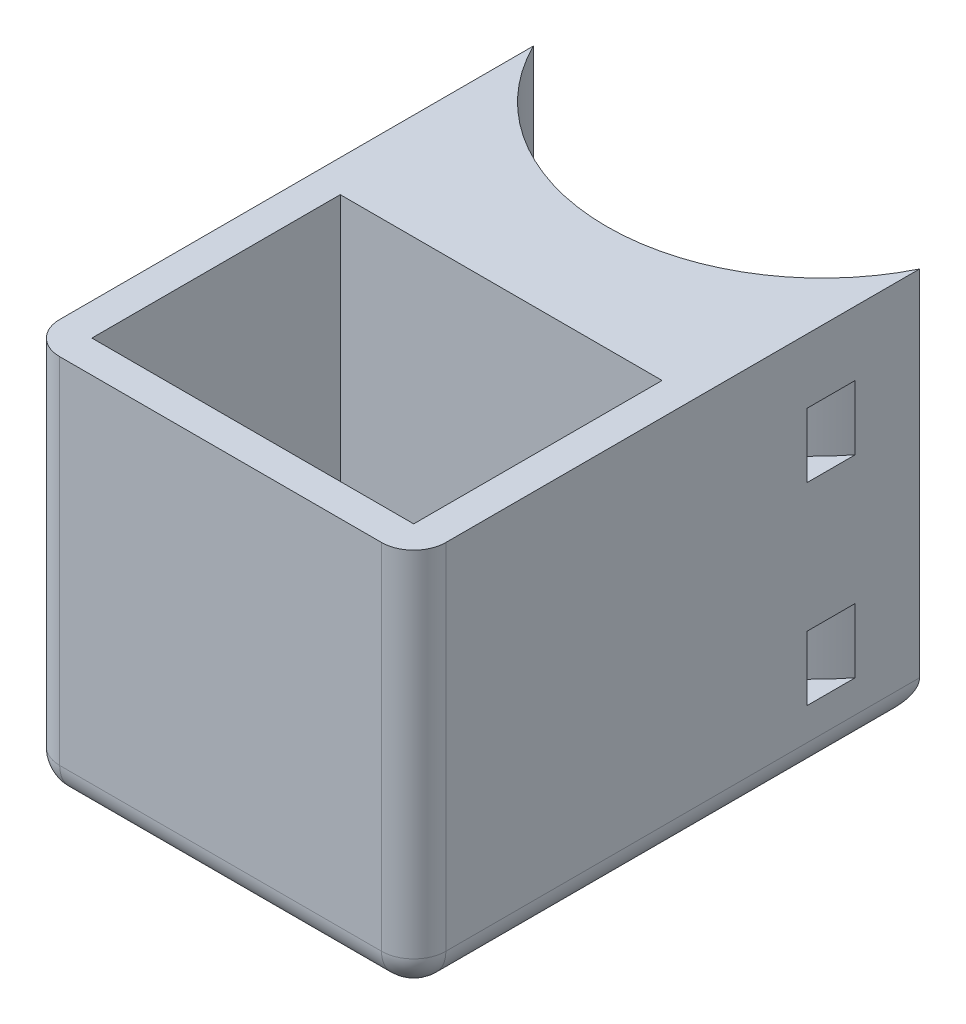
ISO-10303-21;
HEADER;
FILE_DESCRIPTION(('STEP AP214'),'2;1');
FILE_NAME('part.step','',(''),(''),'','','');
FILE_SCHEMA(('AUTOMOTIVE_DESIGN { 1 0 10303 214 1 1 1 1 }'));
ENDSEC;
DATA;
#1=APPLICATION_CONTEXT('core data for automotive mechanical design processes');
#2=APPLICATION_PROTOCOL_DEFINITION('international standard','automotive_design',2000,#1);
#3=PRODUCT_CONTEXT('',#1,'mechanical');
#4=PRODUCT('Part','Part','',(#3));
#5=PRODUCT_RELATED_PRODUCT_CATEGORY('part','',(#4));
#6=PRODUCT_DEFINITION_FORMATION('','',#4);
#7=PRODUCT_DEFINITION_CONTEXT('part definition',#1,'design');
#8=PRODUCT_DEFINITION('design','',#6,#7);
#9=PRODUCT_DEFINITION_SHAPE('','',#8);
#10=(LENGTH_UNIT() NAMED_UNIT(*) SI_UNIT(.MILLI.,.METRE.));
#11=(NAMED_UNIT(*) PLANE_ANGLE_UNIT() SI_UNIT($,.RADIAN.));
#12=(NAMED_UNIT(*) SI_UNIT($,.STERADIAN.) SOLID_ANGLE_UNIT());
#13=UNCERTAINTY_MEASURE_WITH_UNIT(LENGTH_MEASURE(1.E-05),#10,'distance_accuracy_value','');
#14=(GEOMETRIC_REPRESENTATION_CONTEXT(3) GLOBAL_UNCERTAINTY_ASSIGNED_CONTEXT((#13)) GLOBAL_UNIT_ASSIGNED_CONTEXT((#10,
#11,#12)) REPRESENTATION_CONTEXT('',''));
#15=CARTESIAN_POINT('',(0.,0.,0.));
#16=DIRECTION('',(0.,0.,1.));
#17=DIRECTION('',(1.,0.,0.));
#18=AXIS2_PLACEMENT_3D('',#15,#16,#17);
#19=CARTESIAN_POINT('',(0.,127.,-157.374146758345));
#20=DIRECTION('',(0.,-1.,0.));
#21=DIRECTION('',(0.,0.,-1.));
#22=AXIS2_PLACEMENT_3D('',#19,#20,#21);
#23=CYLINDRICAL_SURFACE('',#22,96.5864039940724);
#24=CARTESIAN_POINT('',(0.,50.8,-157.374146758345));
#25=DIRECTION('',(0.,1.,0.));
#26=DIRECTION('',(0.,0.,1.));
#27=AXIS2_PLACEMENT_3D('',#24,#25,#26);
#28=CIRCLE('',#27,96.5864039940724);
#29=CARTESIAN_POINT('',(-76.2,50.8,-98.023549149676));
#30=VERTEX_POINT('',#29);
#31=CARTESIAN_POINT('',(76.2,50.8,-98.023549149676));
#32=VERTEX_POINT('',#31);
#33=EDGE_CURVE('E295',#30,#32,#28,.T.);
#34=ORIENTED_EDGE('',*,*,#33,.F.);
#35=DIRECTION('',(0.,-1.,0.));
#36=VECTOR('',#35,1.);
#37=CARTESIAN_POINT('',(-76.2,127.,-98.023549149676));
#38=LINE('',#37,#36);
#39=CARTESIAN_POINT('',(-76.2,25.4,-98.023549149676));
#40=VERTEX_POINT('',#39);
#41=EDGE_CURVE('E338',#30,#40,#38,.T.);
#42=ORIENTED_EDGE('',*,*,#41,.T.);
#43=CARTESIAN_POINT('',(0.,25.4,-157.374146758345));
#44=DIRECTION('',(0.,1.,0.));
#45=DIRECTION('',(0.,0.,1.));
#46=AXIS2_PLACEMENT_3D('',#43,#44,#45);
#47=CIRCLE('',#46,96.5864039940724);
#48=CARTESIAN_POINT('',(76.2,25.4,-98.023549149676));
#49=VERTEX_POINT('',#48);
#50=EDGE_CURVE('E325',#40,#49,#47,.T.);
#51=ORIENTED_EDGE('',*,*,#50,.T.);
#52=DIRECTION('',(0.,-1.,0.));
#53=VECTOR('',#52,1.);
#54=CARTESIAN_POINT('',(76.2,127.,-98.023549149676));
#55=LINE('',#54,#53);
#56=EDGE_CURVE('E330',#32,#49,#55,.T.);
#57=ORIENTED_EDGE('',*,*,#56,.F.);
#58=EDGE_LOOP('',(#34,#42,#51,#57));
#59=FACE_BOUND('',#58,.T.);
#60=ADVANCED_FACE('F67',(#59),#23,.T.);
#61=CARTESIAN_POINT('',(0.,127.,-153.633996509707));
#62=DIRECTION('',(0.,-1.,0.));
#63=DIRECTION('',(0.,0.,-1.));
#64=AXIS2_PLACEMENT_3D('',#61,#62,#63);
#65=CYLINDRICAL_SURFACE('',#64,106.68);
#66=DIRECTION('',(0.,-1.,0.));
#67=VECTOR('',#66,1.);
#68=CARTESIAN_POINT('',(-76.2,127.,-78.973549149676));
#69=LINE('',#68,#67);
#70=CARTESIAN_POINT('',(-76.2,50.8,-78.973549149676));
#71=VERTEX_POINT('',#70);
#72=CARTESIAN_POINT('',(-76.2,25.4,-78.973549149676));
#73=VERTEX_POINT('',#72);
#74=EDGE_CURVE('E320',#71,#73,#69,.T.);
#75=ORIENTED_EDGE('',*,*,#74,.F.);
#76=CARTESIAN_POINT('',(0.,50.8,-153.633996509707));
#77=DIRECTION('',(0.,1.,0.));
#78=DIRECTION('',(0.,0.,1.));
#79=AXIS2_PLACEMENT_3D('',#76,#77,#78);
#80=CIRCLE('',#79,106.68);
#81=CARTESIAN_POINT('',(76.2,50.8,-78.973549149676));
#82=VERTEX_POINT('',#81);
#83=EDGE_CURVE('E362',#71,#82,#80,.T.);
#84=ORIENTED_EDGE('',*,*,#83,.T.);
#85=DIRECTION('',(0.,-1.,0.));
#86=VECTOR('',#85,1.);
#87=CARTESIAN_POINT('',(76.2,127.,-78.973549149676));
#88=LINE('',#87,#86);
#89=CARTESIAN_POINT('',(76.2,25.4,-78.973549149676));
#90=VERTEX_POINT('',#89);
#91=EDGE_CURVE('E312',#82,#90,#88,.T.);
#92=ORIENTED_EDGE('',*,*,#91,.T.);
#93=CARTESIAN_POINT('',(0.,25.4,-153.633996509707));
#94=DIRECTION('',(0.,1.,0.));
#95=DIRECTION('',(0.,0.,1.));
#96=AXIS2_PLACEMENT_3D('',#93,#94,#95);
#97=CIRCLE('',#96,106.68);
#98=EDGE_CURVE('E308',#73,#90,#97,.T.);
#99=ORIENTED_EDGE('',*,*,#98,.F.);
#100=EDGE_LOOP('',(#75,#84,#92,#99));
#101=FACE_BOUND('',#100,.T.);
#102=ADVANCED_FACE('F461',(#101),#65,.F.);
#103=CARTESIAN_POINT('',(0.,25.4,-161.29));
#104=DIRECTION('',(0.,-1.,0.));
#105=DIRECTION('',(0.,0.,-1.));
#106=AXIS2_PLACEMENT_3D('',#103,#104,#105);
#107=CYLINDRICAL_SURFACE('',#106,85.09);
#108=CARTESIAN_POINT('',(0.,0.,-161.29));
#109=DIRECTION('',(0.,1.,0.));
#110=DIRECTION('',(0.,0.,1.));
#111=AXIS2_PLACEMENT_3D('',#108,#109,#110);
#112=CIRCLE('',#111,85.09);
#113=CARTESIAN_POINT('',(-63.5,0.,-104.650278072716));
#114=VERTEX_POINT('',#113);
#115=CARTESIAN_POINT('',(63.5,0.,-104.650278072716));
#116=VERTEX_POINT('',#115);
#117=EDGE_CURVE('E342',#114,#116,#112,.T.);
#118=ORIENTED_EDGE('',*,*,#117,.F.);
#119=CARTESIAN_POINT('',(-63.5,0.,-104.650278072716));
#120=CARTESIAN_POINT('',(-63.775555582153,1.74329036094173E-05,-104.959199184089));
#121=CARTESIAN_POINT('',(-64.0488209399557,0.00896784177205182,-105.270110950656));
#122=CARTESIAN_POINT('',(-64.5902797715244,0.0439741666666042,-105.895284224631));
#123=CARTESIAN_POINT('',(-64.8584740882358,0.0700272135884523,-106.20954516149));
#124=CARTESIAN_POINT('',(-65.3892789981902,0.138464297963817,-106.840754684055));
#125=CARTESIAN_POINT('',(-65.6518919223825,0.180841370774738,-107.157702067264));
#126=CARTESIAN_POINT('',(-66.1712873683295,0.28129702221995,-107.793854658195));
#127=CARTESIAN_POINT('',(-66.4280695883808,0.339376411355726,-108.113059981637));
#128=CARTESIAN_POINT('',(-67.2001835677938,0.539180619476351,-109.087136619463));
#129=CARTESIAN_POINT('',(-67.7059041821652,0.704974403099761,-109.74493421086));
#130=CARTESIAN_POINT('',(-68.4435332361487,0.998655645986949,-110.73349310702));
#131=CARTESIAN_POINT('',(-68.6859501140861,1.10406574859274,-111.063369518362));
#132=CARTESIAN_POINT('',(-69.163630378677,1.32972857590381,-111.723216079681));
#133=CARTESIAN_POINT('',(-69.3988945102081,1.44997974843511,-112.053186216261));
#134=CARTESIAN_POINT('',(-69.8683009246733,1.70870806981273,-112.721492884302));
#135=CARTESIAN_POINT('',(-70.102241049244,1.8475899629451,-113.059814513359));
#136=CARTESIAN_POINT('',(-70.56209004219,2.14105660425114,-113.735122148983));
#137=CARTESIAN_POINT('',(-70.7879987637361,2.29564163930878,-114.072108131032));
#138=CARTESIAN_POINT('',(-71.2316826726435,2.62097071012814,-114.744132959535));
#139=CARTESIAN_POINT('',(-71.449450509961,2.79172887885392,-115.079169826308));
#140=CARTESIAN_POINT('',(-71.8762805594316,3.14984094161772,-115.745899987749));
#141=CARTESIAN_POINT('',(-72.0853431239304,3.33719416300954,-116.077593417328));
#142=CARTESIAN_POINT('',(-72.4923485521392,3.72746393816045,-116.73312740641));
#143=CARTESIAN_POINT('',(-72.6903791006649,3.93021326973872,-117.057012826747));
#144=CARTESIAN_POINT('',(-73.0769126119393,4.35404071126196,-117.698565360375));
#145=CARTESIAN_POINT('',(-73.2654139336934,4.57512196089213,-118.016231396915));
#146=CARTESIAN_POINT('',(-73.6316780156799,5.03672639947328,-118.642427963342));
#147=CARTESIAN_POINT('',(-73.8094607579908,5.27721132548423,-118.950974908933));
#148=CARTESIAN_POINT('',(-74.1534599769584,5.7799871946011,-119.556398821547));
#149=CARTESIAN_POINT('',(-74.3196825701651,6.04226644244379,-119.853281923244));
#150=CARTESIAN_POINT('',(-74.5722782122996,6.47675118037862,-120.310486569207));
#151=CARTESIAN_POINT('',(-74.6630267166692,6.6408716010198,-120.476096474914));
#152=CARTESIAN_POINT('',(-74.8395678018916,6.97807411838782,-120.800726266946));
#153=CARTESIAN_POINT('',(-74.9253606928205,7.15115565312365,-120.959746565411));
#154=CARTESIAN_POINT('',(-75.0915831168897,7.50732220605154,-121.270088716859));
#155=CARTESIAN_POINT('',(-75.1720007956663,7.69042781299719,-121.421393390487));
#156=CARTESIAN_POINT('',(-75.3265200286137,8.06698337082451,-121.71411259188));
#157=CARTESIAN_POINT('',(-75.4006214326023,8.26043356749192,-121.855526884467));
#158=CARTESIAN_POINT('',(-75.5427070062571,8.6615339346853,-122.128391750724));
#159=CARTESIAN_POINT('',(-75.6105710907129,8.86936480016972,-122.259641171171));
#160=CARTESIAN_POINT('',(-75.7375496067297,9.29675529289151,-122.506614789715));
#161=CARTESIAN_POINT('',(-75.7966623548846,9.51631716567863,-122.622336000408));
#162=CARTESIAN_POINT('',(-75.9042925155677,9.96567379906672,-122.834044455191));
#163=CARTESIAN_POINT('',(-75.9528713952669,10.1953992278935,-122.930145980199));
#164=CARTESIAN_POINT('',(-76.0381808802664,10.6650736779157,-123.099527905418));
#165=CARTESIAN_POINT('',(-76.074922829761,10.9050126594823,-123.172830153499));
#166=CARTESIAN_POINT('',(-76.1358731627378,11.4005069405729,-123.294713622466));
#167=CARTESIAN_POINT('',(-76.159678903631,11.6563142057347,-123.342499948862));
#168=CARTESIAN_POINT('',(-76.1837444242691,12.0445026775911,-123.390851168122));
#169=CARTESIAN_POINT('',(-76.1898264049778,12.1751656766474,-123.40308168428));
#170=CARTESIAN_POINT('',(-76.1979588168233,12.4372039708797,-123.419441356604));
#171=CARTESIAN_POINT('',(-76.2000067035641,12.5685796632276,-123.423565399829));
#172=CARTESIAN_POINT('',(-76.2,12.7,-123.423549149676));
#173=B_SPLINE_CURVE_WITH_KNOTS('',3,(#119,#120,#121,#122,#123,#124,#125,#126,#127,#128,#129,
#130,#131,#132,#133,#134,#135,#136,#137,#138,#139,#140,#141,#142,#143,#144,#145,#146,#147,#148,
#149,#150,#151,#152,#153,#154,#155,#156,#157,#158,#159,#160,#161,#162,#163,#164,#165,#166,#167,
#168,#169,#170,#171,#172),.UNSPECIFIED.,.F.,.F.,(4,2,2,2,2,2,2,2,2,2,2,2,2,2,2,2,2,2,2,2,2,2,2,
2,2,2,4),(0.,1.24171487557004,2.4832214967578,3.72419901500327,4.96524060062538,7.5004109713181,
8.76835159756702,10.0361597266748,11.3382317538429,12.6403275731145,13.9435719212915,
15.2467634693014,16.5374071361811,17.8282723084104,19.1166514225717,20.4043435773973,
21.1546845292604,21.9049784807979,22.6568759508569,23.4087912938205,24.1730232898877,
24.9374021030615,25.6971928482703,26.456253249322,27.2377538242411,27.6316010200848,
28.0256965449931),.UNSPECIFIED.);
#174=CARTESIAN_POINT('',(-76.2,12.7,-123.423549149676));
#175=VERTEX_POINT('',#174);
#176=EDGE_CURVE('E403',#114,#175,#173,.T.);
#177=ORIENTED_EDGE('',*,*,#176,.T.);
#178=DIRECTION('',(0.,-1.,0.));
#179=VECTOR('',#178,1.);
#180=CARTESIAN_POINT('',(-76.2,25.4,-123.423549149676));
#181=LINE('',#180,#179);
#182=CARTESIAN_POINT('',(-76.2,152.4,-123.423549149676));
#183=VERTEX_POINT('',#182);
#184=EDGE_CURVE('E358',#183,#175,#181,.T.);
#185=ORIENTED_EDGE('',*,*,#184,.F.);
#186=CARTESIAN_POINT('',(0.,152.4,-161.29));
#187=DIRECTION('',(0.,1.,0.));
#188=DIRECTION('',(0.,0.,1.));
#189=AXIS2_PLACEMENT_3D('',#186,#187,#188);
#190=CIRCLE('',#189,85.09);
#191=CARTESIAN_POINT('',(76.2,152.4,-123.423549149676));
#192=VERTEX_POINT('',#191);
#193=EDGE_CURVE('E264',#183,#192,#190,.T.);
#194=ORIENTED_EDGE('',*,*,#193,.T.);
#195=DIRECTION('',(0.,-1.,0.));
#196=VECTOR('',#195,1.);
#197=CARTESIAN_POINT('',(76.2,25.4,-123.423549149676));
#198=LINE('',#197,#196);
#199=CARTESIAN_POINT('',(76.2,12.7,-123.423549149676));
#200=VERTEX_POINT('',#199);
#201=EDGE_CURVE('E351',#192,#200,#198,.T.);
#202=ORIENTED_EDGE('',*,*,#201,.T.);
#203=CARTESIAN_POINT('',(76.2,12.7,-123.423549149676));
#204=CARTESIAN_POINT('',(76.2000364031072,12.5227850028577,-123.423633286604));
#205=CARTESIAN_POINT('',(76.1962922413517,12.3456203522404,-123.416088044988));
#206=CARTESIAN_POINT('',(76.181524824488,11.9930589113384,-123.386387149417));
#207=CARTESIAN_POINT('',(76.1705114119517,11.8176600557377,-123.364251251279));
#208=CARTESIAN_POINT('',(76.1416723033843,11.472041720587,-123.306387706787));
#209=CARTESIAN_POINT('',(76.1239358024327,11.3017846637142,-123.270838047564));
#210=CARTESIAN_POINT('',(76.0820933318297,10.9651504964653,-123.187173701231));
#211=CARTESIAN_POINT('',(76.0579849046539,10.798774910096,-123.139054166255));
#212=CARTESIAN_POINT('',(75.9962772417849,10.4243659776945,-123.016250566514));
#213=CARTESIAN_POINT('',(75.9567908599935,10.2178437785034,-122.937902281436));
#214=CARTESIAN_POINT('',(75.8693306219624,9.81338613411481,-122.765175071078));
#215=CARTESIAN_POINT('',(75.8213500255618,9.61545766451327,-122.670783417775));
#216=CARTESIAN_POINT('',(75.7177465527705,9.22765738564796,-122.46804789016));
#217=CARTESIAN_POINT('',(75.6620857149879,9.03783214299981,-122.359634890192));
#218=CARTESIAN_POINT('',(75.5442977916486,8.66729959718517,-122.131556776976));
#219=CARTESIAN_POINT('',(75.4821721280181,8.48659030191176,-122.011894138623));
#220=CARTESIAN_POINT('',(75.3067598792863,8.01037037535388,-121.676155370391));
#221=CARTESIAN_POINT('',(75.18810504352,7.72305724096569,-121.451230086982));
#222=CARTESIAN_POINT('',(74.9374306641949,7.17124914604363,-120.981680578911));
#223=CARTESIAN_POINT('',(74.8054013033035,6.90677121494042,-120.737041911325));
#224=CARTESIAN_POINT('',(74.5299059512961,6.39802106017877,-120.232919445178));
#225=CARTESIAN_POINT('',(74.3864238476469,6.15377832485289,-119.973414882348));
#226=CARTESIAN_POINT('',(74.0895942021372,5.68374960079327,-119.443465502211));
#227=CARTESIAN_POINT('',(73.9362430515393,5.45797043280207,-119.17301669658));
#228=CARTESIAN_POINT('',(73.6285023518672,5.03393029888837,-118.637421830367));
#229=CARTESIAN_POINT('',(73.4745347861818,4.83486207074601,-118.372669119413));
#230=CARTESIAN_POINT('',(73.1592999983338,4.45077999419838,-117.837481416856));
#231=CARTESIAN_POINT('',(72.9980338539346,4.26576408145843,-117.567047267357));
#232=CARTESIAN_POINT('',(72.6685235369962,3.90868410750838,-117.02155282357));
#233=CARTESIAN_POINT('',(72.500273957103,3.73663038458537,-116.746489046304));
#234=CARTESIAN_POINT('',(72.157270141743,3.4049157816904,-116.192965800889));
#235=CARTESIAN_POINT('',(71.9825156851299,3.24525532362255,-115.914506217511));
#236=CARTESIAN_POINT('',(71.6265385929138,2.93758265660326,-115.354640487012));
#237=CARTESIAN_POINT('',(71.4453073078642,2.78958693976158,-115.073230783517));
#238=CARTESIAN_POINT('',(71.0768282289818,2.50510758200027,-114.508525781304));
#239=CARTESIAN_POINT('',(70.8895799482802,2.3686248759183,-114.225230331478));
#240=CARTESIAN_POINT('',(70.319209482159,1.97612188472317,-113.373579847138));
#241=CARTESIAN_POINT('',(69.927322379151,1.73692706568873,-112.803241126725));
#242=CARTESIAN_POINT('',(69.0713008072571,1.27565902768033,-111.590085620099));
#243=CARTESIAN_POINT('',(68.6042527149456,1.05944562006774,-110.94710440681));
#244=CARTESIAN_POINT('',(67.6439331685213,0.684031857035234,-109.663957952845));
#245=CARTESIAN_POINT('',(67.1506631149569,0.524828460144845,-109.023792563745));
#246=CARTESIAN_POINT('',(66.3943955857508,0.331511448804661,-108.071059736497));
#247=CARTESIAN_POINT('',(66.1404369988318,0.274766041142782,-107.755754554211));
#248=CARTESIAN_POINT('',(65.626843641393,0.176626075893765,-107.12737384458));
#249=CARTESIAN_POINT('',(65.3672091288117,0.135230822258515,-106.814298216768));
#250=CARTESIAN_POINT('',(64.842491431825,0.0683840729938934,-106.190767241209));
#251=CARTESIAN_POINT('',(64.5774057938653,0.0429399267060121,-105.880313166212));
#252=CARTESIAN_POINT('',(64.0422920877466,0.00875482924244594,-105.262683477902));
#253=CARTESIAN_POINT('',(63.7722632449072,1.65191620361415E-05,-104.955508390611));
#254=CARTESIAN_POINT('',(63.5,0.,-104.650278072716));
#255=B_SPLINE_CURVE_WITH_KNOTS('',3,(#203,#204,#205,#206,#207,#208,#209,#210,#211,#212,#213,
#214,#215,#216,#217,#218,#219,#220,#221,#222,#223,#224,#225,#226,#227,#228,#229,#230,#231,#232,
#233,#234,#235,#236,#237,#238,#239,#240,#241,#242,#243,#244,#245,#246,#247,#248,#249,#250,#251,
#252,#253,#254),.UNSPECIFIED.,.F.,.F.,(4,2,2,2,2,2,2,2,2,2,2,2,2,2,2,2,2,2,2,2,2,2,2,2,2,4),(0.,
0.53136457549783,1.06201115476813,1.58585099117112,2.10989315768512,2.78199377650747,
3.45463011743346,4.13071888869775,4.80665926857549,5.95581111388693,7.10581267150318,
8.25746165753575,9.4095341774725,10.504947145158,11.6001988803146,12.6963151081495,
13.7924686347357,14.8901451405995,15.9879106903803,18.1825850291348,20.6510852084747,
23.1194536742922,24.3456369223765,25.5717645627498,26.7984567169555,28.0253427880048),.UNSPECIFIED.);
#256=EDGE_CURVE('E395',#200,#116,#255,.T.);
#257=ORIENTED_EDGE('',*,*,#256,.T.);
#258=EDGE_LOOP('',(#118,#177,#185,#194,#202,#257));
#259=FACE_BOUND('',#258,.T.);
#260=ADVANCED_FACE('F410',(#259),#107,.F.);
#261=CARTESIAN_POINT('',(-76.2,25.4,0.));
#262=DIRECTION('',(-1.,0.,0.));
#263=DIRECTION('',(0.,0.,1.));
#264=AXIS2_PLACEMENT_3D('',#261,#262,#263);
#265=PLANE('',#264);
#266=CARTESIAN_POINT('',(-76.2,127.,-98.023549149676));
#267=VERTEX_POINT('',#266);
#268=CARTESIAN_POINT('',(-76.2,101.6,-98.023549149676));
#269=VERTEX_POINT('',#268);
#270=EDGE_CURVE('E339',#267,#269,#38,.T.);
#271=ORIENTED_EDGE('',*,*,#270,.F.);
#272=DIRECTION('',(0.,0.,1.));
#273=VECTOR('',#272,1.);
#274=CARTESIAN_POINT('',(-76.2,127.,-123.423549149676));
#275=LINE('',#274,#273);
#276=CARTESIAN_POINT('',(-76.2,127.,-78.973549149676));
#277=VERTEX_POINT('',#276);
#278=EDGE_CURVE('E269',#267,#277,#275,.T.);
#279=ORIENTED_EDGE('',*,*,#278,.T.);
#280=CARTESIAN_POINT('',(-76.2,101.6,-78.973549149676));
#281=VERTEX_POINT('',#280);
#282=EDGE_CURVE('E321',#277,#281,#69,.T.);
#283=ORIENTED_EDGE('',*,*,#282,.T.);
#284=DIRECTION('',(0.,0.,1.));
#285=VECTOR('',#284,1.);
#286=CARTESIAN_POINT('',(-76.2,101.6,-123.423549149676));
#287=LINE('',#286,#285);
#288=EDGE_CURVE('E287',#269,#281,#287,.T.);
#289=ORIENTED_EDGE('',*,*,#288,.F.);
#290=EDGE_LOOP('',(#271,#279,#283,#289));
#291=FACE_BOUND('',#290,.T.);
#292=ORIENTED_EDGE('',*,*,#184,.T.);
#293=DIRECTION('',(0.,0.,-1.));
#294=VECTOR('',#293,1.);
#295=CARTESIAN_POINT('',(-76.2,12.7,76.2));
#296=LINE('',#295,#294);
#297=CARTESIAN_POINT('',(-76.2,12.7,63.5));
#298=VERTEX_POINT('',#297);
#299=EDGE_CURVE('E517',#175,#298,#296,.F.);
#300=ORIENTED_EDGE('',*,*,#299,.T.);
#301=DIRECTION('',(0.,-1.,0.));
#302=VECTOR('',#301,1.);
#303=CARTESIAN_POINT('',(-76.2,152.4,63.5));
#304=LINE('',#303,#302);
#305=CARTESIAN_POINT('',(-76.2,152.4,63.4999999999999));
#306=VERTEX_POINT('',#305);
#307=EDGE_CURVE('E515',#298,#306,#304,.F.);
#308=ORIENTED_EDGE('',*,*,#307,.T.);
#309=DIRECTION('',(0.,0.,1.));
#310=VECTOR('',#309,1.);
#311=CARTESIAN_POINT('',(-76.2,152.4,-123.423549149676));
#312=LINE('',#311,#310);
#313=EDGE_CURVE('E276',#183,#306,#312,.T.);
#314=ORIENTED_EDGE('',*,*,#313,.F.);
#315=EDGE_LOOP('',(#292,#300,#308,#314));
#316=FACE_BOUND('',#315,.T.);
#317=DIRECTION('',(0.,0.,1.));
#318=VECTOR('',#317,1.);
#319=CARTESIAN_POINT('',(-76.2,50.8,-123.423549149676));
#320=LINE('',#319,#318);
#321=EDGE_CURVE('E280',#30,#71,#320,.T.);
#322=ORIENTED_EDGE('',*,*,#321,.T.);
#323=ORIENTED_EDGE('',*,*,#74,.T.);
#324=DIRECTION('',(0.,0.,-1.));
#325=VECTOR('',#324,1.);
#326=CARTESIAN_POINT('',(-76.2,25.4,0.));
#327=LINE('',#326,#325);
#328=EDGE_CURVE('E343',#73,#40,#327,.T.);
#329=ORIENTED_EDGE('',*,*,#328,.T.);
#330=ORIENTED_EDGE('',*,*,#41,.F.);
#331=EDGE_LOOP('',(#322,#323,#329,#330));
#332=FACE_BOUND('',#331,.T.);
#333=ADVANCED_FACE('F492',(#291,#316,#332),#265,.T.);
#334=CARTESIAN_POINT('',(0.,25.4,76.2));
#335=DIRECTION('',(0.,0.,-1.));
#336=DIRECTION('',(-1.,0.,0.));
#337=AXIS2_PLACEMENT_3D('',#334,#335,#336);
#338=PLANE('',#337);
#339=DIRECTION('',(1.,0.,0.));
#340=VECTOR('',#339,1.);
#341=CARTESIAN_POINT('',(0.,12.7,76.2));
#342=LINE('',#341,#340);
#343=CARTESIAN_POINT('',(-63.5,12.7,76.2));
#344=VERTEX_POINT('',#343);
#345=CARTESIAN_POINT('',(63.5,12.7,76.2));
#346=VERTEX_POINT('',#345);
#347=EDGE_CURVE('E85',#344,#346,#342,.T.);
#348=ORIENTED_EDGE('',*,*,#347,.T.);
#349=DIRECTION('',(0.,-1.,0.));
#350=VECTOR('',#349,1.);
#351=CARTESIAN_POINT('',(63.5,25.4,76.2));
#352=LINE('',#351,#350);
#353=CARTESIAN_POINT('',(63.4999999999999,152.4,76.2));
#354=VERTEX_POINT('',#353);
#355=EDGE_CURVE('E529',#346,#354,#352,.F.);
#356=ORIENTED_EDGE('',*,*,#355,.T.);
#357=DIRECTION('',(1.,0.,0.));
#358=VECTOR('',#357,1.);
#359=CARTESIAN_POINT('',(-76.2,152.4,76.2));
#360=LINE('',#359,#358);
#361=CARTESIAN_POINT('',(-63.5,152.4,76.2));
#362=VERTEX_POINT('',#361);
#363=EDGE_CURVE('E272',#362,#354,#360,.T.);
#364=ORIENTED_EDGE('',*,*,#363,.F.);
#365=DIRECTION('',(0.,-1.,0.));
#366=VECTOR('',#365,1.);
#367=CARTESIAN_POINT('',(-63.5,0.,76.2));
#368=LINE('',#367,#366);
#369=EDGE_CURVE('E90',#362,#344,#368,.T.);
#370=ORIENTED_EDGE('',*,*,#369,.T.);
#371=EDGE_LOOP('',(#348,#356,#364,#370));
#372=FACE_BOUND('',#371,.T.);
#373=ADVANCED_FACE('F503',(#372),#338,.F.);
#374=CARTESIAN_POINT('',(76.2,25.4,0.));
#375=DIRECTION('',(-1.,0.,0.));
#376=DIRECTION('',(0.,0.,1.));
#377=AXIS2_PLACEMENT_3D('',#374,#375,#376);
#378=PLANE('',#377);
#379=DIRECTION('',(0.,-1.,0.));
#380=VECTOR('',#379,1.);
#381=CARTESIAN_POINT('',(76.2,25.4,63.5));
#382=LINE('',#381,#380);
#383=CARTESIAN_POINT('',(76.2,152.4,63.5));
#384=VERTEX_POINT('',#383);
#385=CARTESIAN_POINT('',(76.2,12.7,63.5));
#386=VERTEX_POINT('',#385);
#387=EDGE_CURVE('E519',#384,#386,#382,.T.);
#388=ORIENTED_EDGE('',*,*,#387,.T.);
#389=DIRECTION('',(0.,0.,-1.));
#390=VECTOR('',#389,1.);
#391=CARTESIAN_POINT('',(76.2,12.7,0.));
#392=LINE('',#391,#390);
#393=EDGE_CURVE('E522',#386,#200,#392,.T.);
#394=ORIENTED_EDGE('',*,*,#393,.T.);
#395=ORIENTED_EDGE('',*,*,#201,.F.);
#396=DIRECTION('',(0.,0.,-1.));
#397=VECTOR('',#396,1.);
#398=CARTESIAN_POINT('',(76.2,152.4,76.2));
#399=LINE('',#398,#397);
#400=EDGE_CURVE('E268',#384,#192,#399,.T.);
#401=ORIENTED_EDGE('',*,*,#400,.F.);
#402=EDGE_LOOP('',(#388,#394,#395,#401));
#403=FACE_BOUND('',#402,.T.);
#404=CARTESIAN_POINT('',(76.2,127.,-98.023549149676));
#405=VERTEX_POINT('',#404);
#406=CARTESIAN_POINT('',(76.2,101.6,-98.023549149676));
#407=VERTEX_POINT('',#406);
#408=EDGE_CURVE('E334',#405,#407,#55,.T.);
#409=ORIENTED_EDGE('',*,*,#408,.T.);
#410=DIRECTION('',(0.,0.,-1.));
#411=VECTOR('',#410,1.);
#412=CARTESIAN_POINT('',(76.2,101.6,76.2));
#413=LINE('',#412,#411);
#414=CARTESIAN_POINT('',(76.2,101.6,-78.973549149676));
#415=VERTEX_POINT('',#414);
#416=EDGE_CURVE('E290',#415,#407,#413,.T.);
#417=ORIENTED_EDGE('',*,*,#416,.F.);
#418=CARTESIAN_POINT('',(76.2,127.,-78.973549149676));
#419=VERTEX_POINT('',#418);
#420=EDGE_CURVE('E316',#419,#415,#88,.T.);
#421=ORIENTED_EDGE('',*,*,#420,.F.);
#422=DIRECTION('',(0.,0.,-1.));
#423=VECTOR('',#422,1.);
#424=CARTESIAN_POINT('',(76.2,127.,76.2));
#425=LINE('',#424,#423);
#426=EDGE_CURVE('E258',#419,#405,#425,.T.);
#427=ORIENTED_EDGE('',*,*,#426,.T.);
#428=EDGE_LOOP('',(#409,#417,#421,#427));
#429=FACE_BOUND('',#428,.T.);
#430=ORIENTED_EDGE('',*,*,#91,.F.);
#431=DIRECTION('',(0.,0.,-1.));
#432=VECTOR('',#431,1.);
#433=CARTESIAN_POINT('',(76.2,50.8,76.2));
#434=LINE('',#433,#432);
#435=EDGE_CURVE('E291',#82,#32,#434,.T.);
#436=ORIENTED_EDGE('',*,*,#435,.T.);
#437=ORIENTED_EDGE('',*,*,#56,.T.);
#438=DIRECTION('',(0.,0.,-1.));
#439=VECTOR('',#438,1.);
#440=CARTESIAN_POINT('',(76.2,25.4,0.));
#441=LINE('',#440,#439);
#442=EDGE_CURVE('E347',#90,#49,#441,.T.);
#443=ORIENTED_EDGE('',*,*,#442,.F.);
#444=EDGE_LOOP('',(#430,#436,#437,#443));
#445=FACE_BOUND('',#444,.T.);
#446=ADVANCED_FACE('F500',(#403,#429,#445),#378,.F.);
#447=CARTESIAN_POINT('',(0.,25.4,0.));
#448=DIRECTION('',(0.,1.,0.));
#449=DIRECTION('',(0.,0.,1.));
#450=AXIS2_PLACEMENT_3D('',#447,#448,#449);
#451=PLANE('',#450);
#452=ORIENTED_EDGE('',*,*,#98,.T.);
#453=ORIENTED_EDGE('',*,*,#442,.T.);
#454=ORIENTED_EDGE('',*,*,#50,.F.);
#455=ORIENTED_EDGE('',*,*,#328,.F.);
#456=EDGE_LOOP('',(#452,#453,#454,#455));
#457=FACE_BOUND('',#456,.T.);
#458=ADVANCED_FACE('F481',(#457),#451,.T.);
#459=CARTESIAN_POINT('',(0.,0.,0.));
#460=DIRECTION('',(0.,1.,0.));
#461=DIRECTION('',(0.,0.,1.));
#462=AXIS2_PLACEMENT_3D('',#459,#460,#461);
#463=PLANE('',#462);
#464=CARTESIAN_POINT('',(-13.0048,0.,50.8));
#465=DIRECTION('',(0.,1.,0.));
#466=DIRECTION('',(0.,0.,1.));
#467=AXIS2_PLACEMENT_3D('',#464,#465,#466);
#468=CIRCLE('',#467,11.0284531851085);
#469=CARTESIAN_POINT('',(-13.0048,0.,39.7715468148915));
#470=VERTEX_POINT('',#469);
#471=EDGE_CURVE('E373',#470,#470,#468,.T.);
#472=ORIENTED_EDGE('',*,*,#471,.T.);
#473=EDGE_LOOP('',(#472));
#474=FACE_BOUND('',#473,.T.);
#475=CARTESIAN_POINT('',(13.0048,0.,50.8));
#476=DIRECTION('',(0.,1.,0.));
#477=DIRECTION('',(0.,0.,1.));
#478=AXIS2_PLACEMENT_3D('',#475,#476,#477);
#479=CIRCLE('',#478,11.0284531851085);
#480=CARTESIAN_POINT('',(13.0048,0.,61.8284531851085));
#481=VERTEX_POINT('',#480);
#482=EDGE_CURVE('E369',#481,#481,#479,.T.);
#483=ORIENTED_EDGE('',*,*,#482,.T.);
#484=EDGE_LOOP('',(#483));
#485=FACE_BOUND('',#484,.T.);
#486=DIRECTION('',(1.,0.,0.));
#487=VECTOR('',#486,1.);
#488=CARTESIAN_POINT('',(0.,0.,63.5));
#489=LINE('',#488,#487);
#490=CARTESIAN_POINT('',(63.5,0.,63.5));
#491=VERTEX_POINT('',#490);
#492=CARTESIAN_POINT('',(-63.5,0.,63.5));
#493=VERTEX_POINT('',#492);
#494=EDGE_CURVE('E385',#491,#493,#489,.F.);
#495=ORIENTED_EDGE('',*,*,#494,.T.);
#496=DIRECTION('',(0.,0.,-1.));
#497=VECTOR('',#496,1.);
#498=CARTESIAN_POINT('',(-63.5,0.,-123.423549149676));
#499=LINE('',#498,#497);
#500=EDGE_CURVE('E391',#493,#114,#499,.T.);
#501=ORIENTED_EDGE('',*,*,#500,.T.);
#502=ORIENTED_EDGE('',*,*,#117,.T.);
#503=DIRECTION('',(0.,0.,-1.));
#504=VECTOR('',#503,1.);
#505=CARTESIAN_POINT('',(63.5,0.,0.));
#506=LINE('',#505,#504);
#507=EDGE_CURVE('E388',#116,#491,#506,.F.);
#508=ORIENTED_EDGE('',*,*,#507,.T.);
#509=EDGE_LOOP('',(#495,#501,#502,#508));
#510=FACE_BOUND('',#509,.T.);
#511=ADVANCED_FACE('F473',(#474,#485,#510),#463,.F.);
#512=ORIENTED_EDGE('',*,*,#270,.T.);
#513=CARTESIAN_POINT('',(0.,101.6,-157.374146758345));
#514=DIRECTION('',(0.,1.,0.));
#515=DIRECTION('',(0.,0.,1.));
#516=AXIS2_PLACEMENT_3D('',#513,#514,#515);
#517=CIRCLE('',#516,96.5864039940724);
#518=EDGE_CURVE('E305',#269,#407,#517,.T.);
#519=ORIENTED_EDGE('',*,*,#518,.T.);
#520=ORIENTED_EDGE('',*,*,#408,.F.);
#521=CARTESIAN_POINT('',(0.,127.,-157.374146758345));
#522=DIRECTION('',(0.,1.,0.));
#523=DIRECTION('',(0.,0.,1.));
#524=AXIS2_PLACEMENT_3D('',#521,#522,#523);
#525=CIRCLE('',#524,96.5864039940724);
#526=EDGE_CURVE('E326',#267,#405,#525,.T.);
#527=ORIENTED_EDGE('',*,*,#526,.F.);
#528=EDGE_LOOP('',(#512,#519,#520,#527));
#529=FACE_BOUND('',#528,.T.);
#530=ADVANCED_FACE('F464',(#529),#23,.T.);
#531=CARTESIAN_POINT('',(0.,101.6,-153.633996509707));
#532=DIRECTION('',(0.,1.,0.));
#533=DIRECTION('',(0.,0.,1.));
#534=AXIS2_PLACEMENT_3D('',#531,#532,#533);
#535=CIRCLE('',#534,106.68);
#536=EDGE_CURVE('E366',#281,#415,#535,.T.);
#537=ORIENTED_EDGE('',*,*,#536,.F.);
#538=ORIENTED_EDGE('',*,*,#282,.F.);
#539=CARTESIAN_POINT('',(0.,127.,-153.633996509707));
#540=DIRECTION('',(0.,1.,0.));
#541=DIRECTION('',(0.,0.,1.));
#542=AXIS2_PLACEMENT_3D('',#539,#540,#541);
#543=CIRCLE('',#542,106.68);
#544=EDGE_CURVE('E309',#277,#419,#543,.T.);
#545=ORIENTED_EDGE('',*,*,#544,.T.);
#546=ORIENTED_EDGE('',*,*,#420,.T.);
#547=EDGE_LOOP('',(#537,#538,#545,#546));
#548=FACE_BOUND('',#547,.T.);
#549=ADVANCED_FACE('F470',(#548),#65,.F.);
#550=CARTESIAN_POINT('',(0.,101.6,-161.29));
#551=DIRECTION('',(0.,1.,0.));
#552=DIRECTION('',(0.,0.,1.));
#553=AXIS2_PLACEMENT_3D('',#550,#551,#552);
#554=PLANE('',#553);
#555=ORIENTED_EDGE('',*,*,#518,.F.);
#556=ORIENTED_EDGE('',*,*,#288,.T.);
#557=ORIENTED_EDGE('',*,*,#536,.T.);
#558=ORIENTED_EDGE('',*,*,#416,.T.);
#559=EDGE_LOOP('',(#555,#556,#557,#558));
#560=FACE_BOUND('',#559,.T.);
#561=ADVANCED_FACE('F479',(#560),#554,.T.);
#562=CARTESIAN_POINT('',(0.,50.8,-161.29));
#563=DIRECTION('',(0.,1.,0.));
#564=DIRECTION('',(0.,0.,1.));
#565=AXIS2_PLACEMENT_3D('',#562,#563,#564);
#566=PLANE('',#565);
#567=ORIENTED_EDGE('',*,*,#321,.F.);
#568=ORIENTED_EDGE('',*,*,#33,.T.);
#569=ORIENTED_EDGE('',*,*,#435,.F.);
#570=ORIENTED_EDGE('',*,*,#83,.F.);
#571=EDGE_LOOP('',(#567,#568,#569,#570));
#572=FACE_BOUND('',#571,.T.);
#573=ADVANCED_FACE('F596',(#572),#566,.F.);
#574=CARTESIAN_POINT('',(0.,127.,-161.29));
#575=DIRECTION('',(0.,1.,0.));
#576=DIRECTION('',(0.,0.,1.));
#577=AXIS2_PLACEMENT_3D('',#574,#575,#576);
#578=PLANE('',#577);
#579=ORIENTED_EDGE('',*,*,#278,.F.);
#580=ORIENTED_EDGE('',*,*,#526,.T.);
#581=ORIENTED_EDGE('',*,*,#426,.F.);
#582=ORIENTED_EDGE('',*,*,#544,.F.);
#583=EDGE_LOOP('',(#579,#580,#581,#582));
#584=FACE_BOUND('',#583,.T.);
#585=ADVANCED_FACE('F498',(#584),#578,.F.);
#586=CARTESIAN_POINT('',(0.,152.4,-161.29));
#587=DIRECTION('',(0.,1.,0.));
#588=DIRECTION('',(0.,0.,1.));
#589=AXIS2_PLACEMENT_3D('',#586,#587,#588);
#590=PLANE('',#589);
#591=DIRECTION('',(0.,0.,1.));
#592=VECTOR('',#591,1.);
#593=CARTESIAN_POINT('',(-63.5,152.4,63.5));
#594=LINE('',#593,#592);
#595=CARTESIAN_POINT('',(-63.5,152.4,-34.5235491496761));
#596=VERTEX_POINT('',#595);
#597=CARTESIAN_POINT('',(-63.5,152.4,63.5));
#598=VERTEX_POINT('',#597);
#599=EDGE_CURVE('E212',#596,#598,#594,.T.);
#600=ORIENTED_EDGE('',*,*,#599,.F.);
#601=DIRECTION('',(-1.,0.,0.));
#602=VECTOR('',#601,1.);
#603=CARTESIAN_POINT('',(-63.5,152.4,-34.5235491496761));
#604=LINE('',#603,#602);
#605=CARTESIAN_POINT('',(63.5,152.4,-34.5235491496761));
#606=VERTEX_POINT('',#605);
#607=EDGE_CURVE('E232',#606,#596,#604,.T.);
#608=ORIENTED_EDGE('',*,*,#607,.F.);
#609=DIRECTION('',(0.,0.,-1.));
#610=VECTOR('',#609,1.);
#611=CARTESIAN_POINT('',(63.5,152.4,63.5));
#612=LINE('',#611,#610);
#613=CARTESIAN_POINT('',(63.5,152.4,63.5));
#614=VERTEX_POINT('',#613);
#615=EDGE_CURVE('E236',#614,#606,#612,.T.);
#616=ORIENTED_EDGE('',*,*,#615,.F.);
#617=DIRECTION('',(1.,0.,0.));
#618=VECTOR('',#617,1.);
#619=CARTESIAN_POINT('',(-63.5,152.4,63.5));
#620=LINE('',#619,#618);
#621=EDGE_CURVE('E248',#598,#614,#620,.T.);
#622=ORIENTED_EDGE('',*,*,#621,.F.);
#623=EDGE_LOOP('',(#600,#608,#616,#622));
#624=FACE_BOUND('',#623,.T.);
#625=ORIENTED_EDGE('',*,*,#363,.T.);
#626=CARTESIAN_POINT('',(63.5,152.4,63.5));
#627=DIRECTION('',(0.,1.,0.));
#628=DIRECTION('',(0.,0.,1.));
#629=AXIS2_PLACEMENT_3D('',#626,#627,#628);
#630=CIRCLE('',#629,12.7);
#631=EDGE_CURVE('E12',#354,#384,#630,.T.);
#632=ORIENTED_EDGE('',*,*,#631,.T.);
#633=ORIENTED_EDGE('',*,*,#400,.T.);
#634=ORIENTED_EDGE('',*,*,#193,.F.);
#635=ORIENTED_EDGE('',*,*,#313,.T.);
#636=CARTESIAN_POINT('',(-63.5,152.4,63.5));
#637=DIRECTION('',(0.,1.,0.));
#638=DIRECTION('',(0.,0.,1.));
#639=AXIS2_PLACEMENT_3D('',#636,#637,#638);
#640=CIRCLE('',#639,12.7);
#641=EDGE_CURVE('E77',#306,#362,#640,.T.);
#642=ORIENTED_EDGE('',*,*,#641,.T.);
#643=EDGE_LOOP('',(#625,#632,#633,#634,#635,#642));
#644=FACE_BOUND('',#643,.T.);
#645=ADVANCED_FACE('F590',(#624,#644),#590,.T.);
#646=CARTESIAN_POINT('',(-63.5,12.7,63.5));
#647=DIRECTION('',(-1.,0.,0.));
#648=DIRECTION('',(0.,0.,1.));
#649=AXIS2_PLACEMENT_3D('',#646,#647,#648);
#650=PLANE('',#649);
#651=ORIENTED_EDGE('',*,*,#599,.T.);
#652=DIRECTION('',(0.,1.,0.));
#653=VECTOR('',#652,1.);
#654=CARTESIAN_POINT('',(-63.5,12.7,63.5));
#655=LINE('',#654,#653);
#656=CARTESIAN_POINT('',(-63.5,12.7,63.5));
#657=VERTEX_POINT('',#656);
#658=EDGE_CURVE('E205',#657,#598,#655,.T.);
#659=ORIENTED_EDGE('',*,*,#658,.F.);
#660=DIRECTION('',(0.,0.,1.));
#661=VECTOR('',#660,1.);
#662=CARTESIAN_POINT('',(-63.5,12.7,63.5));
#663=LINE('',#662,#661);
#664=CARTESIAN_POINT('',(-63.5,12.7,-34.5235491496761));
#665=VERTEX_POINT('',#664);
#666=EDGE_CURVE('E209',#665,#657,#663,.T.);
#667=ORIENTED_EDGE('',*,*,#666,.F.);
#668=DIRECTION('',(0.,1.,0.));
#669=VECTOR('',#668,1.);
#670=CARTESIAN_POINT('',(-63.5,12.7,-34.5235491496761));
#671=LINE('',#670,#669);
#672=EDGE_CURVE('E255',#665,#596,#671,.T.);
#673=ORIENTED_EDGE('',*,*,#672,.T.);
#674=EDGE_LOOP('',(#651,#659,#667,#673));
#675=FACE_BOUND('',#674,.T.);
#676=ADVANCED_FACE('F207',(#675),#650,.F.);
#677=CARTESIAN_POINT('',(-63.5,12.7,-34.5235491496761));
#678=DIRECTION('',(0.,0.,-1.));
#679=DIRECTION('',(-1.,0.,0.));
#680=AXIS2_PLACEMENT_3D('',#677,#678,#679);
#681=PLANE('',#680);
#682=ORIENTED_EDGE('',*,*,#607,.T.);
#683=ORIENTED_EDGE('',*,*,#672,.F.);
#684=DIRECTION('',(-1.,0.,0.));
#685=VECTOR('',#684,1.);
#686=CARTESIAN_POINT('',(-63.5,12.7,-34.5235491496761));
#687=LINE('',#686,#685);
#688=CARTESIAN_POINT('',(63.5,12.7,-34.5235491496761));
#689=VERTEX_POINT('',#688);
#690=EDGE_CURVE('E218',#689,#665,#687,.T.);
#691=ORIENTED_EDGE('',*,*,#690,.F.);
#692=DIRECTION('',(0.,1.,0.));
#693=VECTOR('',#692,1.);
#694=CARTESIAN_POINT('',(63.5,12.7,-34.5235491496761));
#695=LINE('',#694,#693);
#696=EDGE_CURVE('E259',#689,#606,#695,.T.);
#697=ORIENTED_EDGE('',*,*,#696,.T.);
#698=EDGE_LOOP('',(#682,#683,#691,#697));
#699=FACE_BOUND('',#698,.T.);
#700=ADVANCED_FACE('F581',(#699),#681,.F.);
#701=CARTESIAN_POINT('',(63.5,12.7,63.5));
#702=DIRECTION('',(1.,0.,0.));
#703=DIRECTION('',(0.,0.,-1.));
#704=AXIS2_PLACEMENT_3D('',#701,#702,#703);
#705=PLANE('',#704);
#706=ORIENTED_EDGE('',*,*,#615,.T.);
#707=ORIENTED_EDGE('',*,*,#696,.F.);
#708=DIRECTION('',(0.,0.,-1.));
#709=VECTOR('',#708,1.);
#710=CARTESIAN_POINT('',(63.5,12.7,63.5));
#711=LINE('',#710,#709);
#712=CARTESIAN_POINT('',(63.5,12.7,63.5));
#713=VERTEX_POINT('',#712);
#714=EDGE_CURVE('E227',#713,#689,#711,.T.);
#715=ORIENTED_EDGE('',*,*,#714,.F.);
#716=DIRECTION('',(0.,1.,0.));
#717=VECTOR('',#716,1.);
#718=CARTESIAN_POINT('',(63.5,12.7,63.5));
#719=LINE('',#718,#717);
#720=EDGE_CURVE('E217',#713,#614,#719,.T.);
#721=ORIENTED_EDGE('',*,*,#720,.T.);
#722=EDGE_LOOP('',(#706,#707,#715,#721));
#723=FACE_BOUND('',#722,.T.);
#724=ADVANCED_FACE('F578',(#723),#705,.F.);
#725=CARTESIAN_POINT('',(-63.5,12.7,63.5));
#726=DIRECTION('',(0.,0.,1.));
#727=DIRECTION('',(1.,0.,0.));
#728=AXIS2_PLACEMENT_3D('',#725,#726,#727);
#729=PLANE('',#728);
#730=ORIENTED_EDGE('',*,*,#621,.T.);
#731=ORIENTED_EDGE('',*,*,#720,.F.);
#732=DIRECTION('',(1.,0.,0.));
#733=VECTOR('',#732,1.);
#734=CARTESIAN_POINT('',(-63.5,12.7,63.5));
#735=LINE('',#734,#733);
#736=EDGE_CURVE('E221',#657,#713,#735,.T.);
#737=ORIENTED_EDGE('',*,*,#736,.F.);
#738=ORIENTED_EDGE('',*,*,#658,.T.);
#739=EDGE_LOOP('',(#730,#731,#737,#738));
#740=FACE_BOUND('',#739,.T.);
#741=ADVANCED_FACE('F222',(#740),#729,.F.);
#742=CARTESIAN_POINT('',(0.,12.7,0.));
#743=DIRECTION('',(0.,-1.,0.));
#744=DIRECTION('',(0.,0.,-1.));
#745=AXIS2_PLACEMENT_3D('',#742,#743,#744);
#746=PLANE('',#745);
#747=CARTESIAN_POINT('',(-13.0048,12.7,50.8));
#748=DIRECTION('',(0.,1.,0.));
#749=DIRECTION('',(0.,0.,1.));
#750=AXIS2_PLACEMENT_3D('',#747,#748,#749);
#751=CIRCLE('',#750,8.255);
#752=CARTESIAN_POINT('',(-13.0048,12.7,59.055));
#753=VERTEX_POINT('',#752);
#754=EDGE_CURVE('E249',#753,#753,#751,.T.);
#755=ORIENTED_EDGE('',*,*,#754,.F.);
#756=EDGE_LOOP('',(#755));
#757=FACE_BOUND('',#756,.T.);
#758=CARTESIAN_POINT('',(13.0048,12.7,50.8));
#759=DIRECTION('',(0.,1.,0.));
#760=DIRECTION('',(0.,0.,1.));
#761=AXIS2_PLACEMENT_3D('',#758,#759,#760);
#762=CIRCLE('',#761,8.255);
#763=CARTESIAN_POINT('',(13.0048,12.7,59.055));
#764=VERTEX_POINT('',#763);
#765=EDGE_CURVE('E239',#764,#764,#762,.T.);
#766=ORIENTED_EDGE('',*,*,#765,.F.);
#767=EDGE_LOOP('',(#766));
#768=FACE_BOUND('',#767,.T.);
#769=ORIENTED_EDGE('',*,*,#666,.T.);
#770=ORIENTED_EDGE('',*,*,#736,.T.);
#771=ORIENTED_EDGE('',*,*,#714,.T.);
#772=ORIENTED_EDGE('',*,*,#690,.T.);
#773=EDGE_LOOP('',(#769,#770,#771,#772));
#774=FACE_BOUND('',#773,.T.);
#775=ADVANCED_FACE('F229',(#757,#768,#774),#746,.F.);
#776=CARTESIAN_POINT('',(13.0048,0.,50.8));
#777=DIRECTION('',(0.,1.,0.));
#778=DIRECTION('',(0.,0.,1.));
#779=AXIS2_PLACEMENT_3D('',#776,#777,#778);
#780=CYLINDRICAL_SURFACE('',#779,8.255);
#781=CARTESIAN_POINT('',(13.0048,7.62000000000009,50.8));
#782=DIRECTION('',(0.,1.,0.));
#783=DIRECTION('',(0.,0.,1.));
#784=AXIS2_PLACEMENT_3D('',#781,#782,#783);
#785=CIRCLE('',#784,8.255);
#786=CARTESIAN_POINT('',(13.0048,7.62000000000009,59.055));
#787=VERTEX_POINT('',#786);
#788=EDGE_CURVE('E381',#787,#787,#785,.F.);
#789=ORIENTED_EDGE('',*,*,#788,.T.);
#790=EDGE_LOOP('',(#789));
#791=FACE_BOUND('',#790,.T.);
#792=ORIENTED_EDGE('',*,*,#765,.T.);
#793=EDGE_LOOP('',(#792));
#794=FACE_BOUND('',#793,.T.);
#795=ADVANCED_FACE('F455',(#791,#794),#780,.F.);
#796=CARTESIAN_POINT('',(-13.0048,0.,50.8));
#797=DIRECTION('',(0.,1.,0.));
#798=DIRECTION('',(0.,0.,1.));
#799=AXIS2_PLACEMENT_3D('',#796,#797,#798);
#800=CYLINDRICAL_SURFACE('',#799,8.255);
#801=CARTESIAN_POINT('',(-13.0048,7.62000000000009,50.8));
#802=DIRECTION('',(0.,1.,0.));
#803=DIRECTION('',(0.,0.,1.));
#804=AXIS2_PLACEMENT_3D('',#801,#802,#803);
#805=CIRCLE('',#804,8.255);
#806=CARTESIAN_POINT('',(-13.0048,7.62000000000009,42.545));
#807=VERTEX_POINT('',#806);
#808=EDGE_CURVE('E377',#807,#807,#805,.F.);
#809=ORIENTED_EDGE('',*,*,#808,.T.);
#810=EDGE_LOOP('',(#809));
#811=FACE_BOUND('',#810,.T.);
#812=ORIENTED_EDGE('',*,*,#754,.T.);
#813=EDGE_LOOP('',(#812));
#814=FACE_BOUND('',#813,.T.);
#815=ADVANCED_FACE('F450',(#811,#814),#800,.F.);
#816=CARTESIAN_POINT('',(-13.0048,0.,50.8));
#817=DIRECTION('',(0.,-1.,0.));
#818=DIRECTION('',(0.,0.,-1.));
#819=AXIS2_PLACEMENT_3D('',#816,#817,#818);
#820=CONICAL_SURFACE('',#819,11.0284531851085,0.349065850398863);
#821=CARTESIAN_POINT('',(-13.0048,7.62000000000009,42.545));
#822=CARTESIAN_POINT('',(-13.0048,7.54062500000008,42.5161098626551));
#823=CARTESIAN_POINT('',(-13.0048,7.46125000000008,42.4872197253102));
#824=CARTESIAN_POINT('',(-13.0048,7.30250000000008,42.4294394506205));
#825=CARTESIAN_POINT('',(-13.0048,7.22312500000008,42.4005493132756));
#826=CARTESIAN_POINT('',(-13.0048,7.06437500000008,42.3427690385858));
#827=CARTESIAN_POINT('',(-13.0048,6.98500000000008,42.313878901241));
#828=CARTESIAN_POINT('',(-13.0048,6.82625000000008,42.2560986265512));
#829=CARTESIAN_POINT('',(-13.0048,6.74687500000008,42.2272084892063));
#830=CARTESIAN_POINT('',(-13.0048,6.58812500000007,42.1694282145166));
#831=CARTESIAN_POINT('',(-13.0048,6.50875000000007,42.1405380771717));
#832=CARTESIAN_POINT('',(-13.0048,6.35000000000007,42.0827578024819));
#833=CARTESIAN_POINT('',(-13.0048,6.27062500000007,42.053867665137));
#834=CARTESIAN_POINT('',(-13.0048,6.11187500000007,41.9960873904473));
#835=CARTESIAN_POINT('',(-13.0048,6.03250000000007,41.9671972531024));
#836=CARTESIAN_POINT('',(-13.0048,5.87375000000007,41.9094169784126));
#837=CARTESIAN_POINT('',(-13.0048,5.79437500000007,41.8805268410678));
#838=CARTESIAN_POINT('',(-13.0048,5.63562500000006,41.822746566378));
#839=CARTESIAN_POINT('',(-13.0048,5.55625000000006,41.7938564290331));
#840=CARTESIAN_POINT('',(-13.0048,5.39750000000006,41.7360761543434));
#841=CARTESIAN_POINT('',(-13.0048,5.31812500000006,41.7071860169985));
#842=CARTESIAN_POINT('',(-13.0048,5.15937500000006,41.6494057423087));
#843=CARTESIAN_POINT('',(-13.0048,5.08000000000006,41.6205156049638));
#844=CARTESIAN_POINT('',(-13.0048,4.92125000000005,41.5627353302741));
#845=CARTESIAN_POINT('',(-13.0048,4.84187500000005,41.5338451929292));
#846=CARTESIAN_POINT('',(-13.0048,4.68312500000005,41.4760649182394));
#847=CARTESIAN_POINT('',(-13.0048,4.60375000000005,41.4471747808946));
#848=CARTESIAN_POINT('',(-13.0048,4.44500000000005,41.3893945062048));
#849=CARTESIAN_POINT('',(-13.0048,4.36562500000005,41.3605043688599));
#850=CARTESIAN_POINT('',(-13.0048,4.20687500000005,41.3027240941702));
#851=CARTESIAN_POINT('',(-13.0048,4.12750000000005,41.2738339568253));
#852=CARTESIAN_POINT('',(-13.0048,3.96875000000005,41.2160536821355));
#853=CARTESIAN_POINT('',(-13.0048,3.88937500000004,41.1871635447906));
#854=CARTESIAN_POINT('',(-13.0048,3.73062500000004,41.1293832701009));
#855=CARTESIAN_POINT('',(-13.0048,3.65125000000004,41.100493132756));
#856=CARTESIAN_POINT('',(-13.0048,3.49250000000004,41.0427128580662));
#857=CARTESIAN_POINT('',(-13.0048,3.41312500000004,41.0138227207214));
#858=CARTESIAN_POINT('',(-13.0048,3.25437500000004,40.9560424460316));
#859=CARTESIAN_POINT('',(-13.0048,3.17500000000004,40.9271523086867));
#860=CARTESIAN_POINT('',(-13.0048,3.01625000000003,40.869372033997));
#861=CARTESIAN_POINT('',(-13.0048,2.93687500000003,40.8404818966521));
#862=CARTESIAN_POINT('',(-13.0048,2.77812500000003,40.7827016219623));
#863=CARTESIAN_POINT('',(-13.0048,2.69875000000003,40.7538114846175));
#864=CARTESIAN_POINT('',(-13.0048,2.54000000000003,40.6960312099277));
#865=CARTESIAN_POINT('',(-13.0048,2.46062500000003,40.6671410725828));
#866=CARTESIAN_POINT('',(-13.0048,2.30187500000003,40.609360797893));
#867=CARTESIAN_POINT('',(-13.0048,2.22250000000003,40.5804706605482));
#868=CARTESIAN_POINT('',(-13.0048,2.06375000000002,40.5226903858584));
#869=CARTESIAN_POINT('',(-13.0048,1.98437500000002,40.4938002485135));
#870=CARTESIAN_POINT('',(-13.0048,1.82562500000002,40.4360199738238));
#871=CARTESIAN_POINT('',(-13.0048,1.74625000000002,40.4071298364789));
#872=CARTESIAN_POINT('',(-13.0048,1.58750000000002,40.3493495617891));
#873=CARTESIAN_POINT('',(-13.0048,1.50812500000002,40.3204594244443));
#874=CARTESIAN_POINT('',(-13.0048,1.34937500000002,40.2626791497545));
#875=CARTESIAN_POINT('',(-13.0048,1.27000000000001,40.2337890124096));
#876=CARTESIAN_POINT('',(-13.0048,1.11125000000001,40.1760087377198));
#877=CARTESIAN_POINT('',(-13.0048,1.03187500000001,40.147118600375));
#878=CARTESIAN_POINT('',(-13.0048,0.87312500000001,40.0893383256852));
#879=CARTESIAN_POINT('',(-13.0048,0.793750000000009,40.0604481883403));
#880=CARTESIAN_POINT('',(-13.0048,0.635000000000007,40.0026679136506));
#881=CARTESIAN_POINT('',(-13.0048,0.555625000000006,39.9737777763057));
#882=CARTESIAN_POINT('',(-13.0048,0.396875000000005,39.9159975016159));
#883=CARTESIAN_POINT('',(-13.0048,0.317500000000004,39.8871073642711));
#884=CARTESIAN_POINT('',(-13.0048,0.158750000000002,39.8293270895813));
#885=CARTESIAN_POINT('',(-13.0048,0.0793750000000011,39.8004369522364));
#886=CARTESIAN_POINT('',(-13.0048,0.,39.7715468148915));
#887=B_SPLINE_CURVE_WITH_KNOTS('',3,(#821,#822,#823,#824,#825,#826,#827,#828,#829,#830,#831,
#832,#833,#834,#835,#836,#837,#838,#839,#840,#841,#842,#843,#844,#845,#846,#847,#848,#849,#850,
#851,#852,#853,#854,#855,#856,#857,#858,#859,#860,#861,#862,#863,#864,#865,#866,#867,#868,#869,
#870,#871,#872,#873,#874,#875,#876,#877,#878,#879,#880,#881,#882,#883,#884,#885,#886),
.UNSPECIFIED.,.F.,.F.,(4,2,2,2,2,2,2,2,2,2,2,2,2,2,2,2,2,2,2,2,2,2,2,2,2,2,2,2,2,2,2,2,4),(0.,
0.25340733207083,0.506814664141658,0.760221996212488,1.01362932828332,1.26703666035415,
1.52044399242498,1.7738513244958,2.02725865656663,2.28066598863746,2.53407332070829,
2.78748065277912,3.04088798484995,3.29429531692078,3.54770264899161,3.80110998106244,
4.05451731313327,4.3079246452041,4.56133197727493,4.81473930934575,5.06814664141658,
5.32155397348741,5.57496130555824,5.82836863762907,6.0817759696999,6.33518330177073,
6.58859063384156,6.84199796591239,7.09540529798322,7.34881263005405,7.60221996212488,
7.85562729419571,8.10903462626654),.UNSPECIFIED.);
#888=EDGE_CURVE('BSEAM445',#807,#470,#887,.T.);
#889=ORIENTED_EDGE('',*,*,#808,.F.);
#890=ORIENTED_EDGE('',*,*,#471,.F.);
#891=ORIENTED_EDGE('',*,*,#888,.T.);
#892=ORIENTED_EDGE('',*,*,#888,.F.);
#893=EDGE_LOOP('',(#889,#891,#890,#892));
#894=FACE_BOUND('',#893,.T.);
#895=ADVANCED_FACE('F445',(#894),#820,.F.);
#896=CARTESIAN_POINT('',(13.0048,0.,50.8));
#897=DIRECTION('',(0.,-1.,0.));
#898=DIRECTION('',(0.,0.,-1.));
#899=AXIS2_PLACEMENT_3D('',#896,#897,#898);
#900=CONICAL_SURFACE('',#899,11.0284531851085,0.349065850398863);
#901=ORIENTED_EDGE('',*,*,#788,.F.);
#902=EDGE_LOOP('',(#901));
#903=FACE_BOUND('',#902,.T.);
#904=ORIENTED_EDGE('',*,*,#482,.F.);
#905=EDGE_LOOP('',(#904));
#906=FACE_BOUND('',#905,.T.);
#907=ADVANCED_FACE('F440',(#903,#906),#900,.F.);
#908=CARTESIAN_POINT('',(63.5,25.4,63.5));
#909=DIRECTION('',(0.,-1.,0.));
#910=DIRECTION('',(0.,0.,-1.));
#911=AXIS2_PLACEMENT_3D('',#908,#909,#910);
#912=CYLINDRICAL_SURFACE('',#911,12.7);
#913=ORIENTED_EDGE('',*,*,#631,.F.);
#914=ORIENTED_EDGE('',*,*,#355,.F.);
#915=CARTESIAN_POINT('',(63.5,12.7,63.5));
#916=DIRECTION('',(0.,-1.,0.));
#917=DIRECTION('',(0.,0.,-1.));
#918=AXIS2_PLACEMENT_3D('',#915,#916,#917);
#919=CIRCLE('',#918,12.7);
#920=EDGE_CURVE('E71',#386,#346,#919,.T.);
#921=ORIENTED_EDGE('',*,*,#920,.F.);
#922=ORIENTED_EDGE('',*,*,#387,.F.);
#923=EDGE_LOOP('',(#913,#914,#921,#922));
#924=FACE_BOUND('',#923,.T.);
#925=ADVANCED_FACE('F69',(#924),#912,.T.);
#926=CARTESIAN_POINT('',(63.5,12.7,0.));
#927=DIRECTION('',(0.,0.,-1.));
#928=DIRECTION('',(-1.,0.,0.));
#929=AXIS2_PLACEMENT_3D('',#926,#927,#928);
#930=CYLINDRICAL_SURFACE('',#929,12.7);
#931=ORIENTED_EDGE('',*,*,#256,.F.);
#932=ORIENTED_EDGE('',*,*,#393,.F.);
#933=CARTESIAN_POINT('',(63.5,12.7,63.5));
#934=DIRECTION('',(0.,0.,1.));
#935=DIRECTION('',(1.,0.,0.));
#936=AXIS2_PLACEMENT_3D('',#933,#934,#935);
#937=CIRCLE('',#936,12.7);
#938=EDGE_CURVE('E552',#491,#386,#937,.T.);
#939=ORIENTED_EDGE('',*,*,#938,.F.);
#940=ORIENTED_EDGE('',*,*,#507,.F.);
#941=EDGE_LOOP('',(#931,#932,#939,#940));
#942=FACE_BOUND('',#941,.T.);
#943=ADVANCED_FACE('F414',(#942),#930,.T.);
#944=CARTESIAN_POINT('',(63.5,12.7,63.5));
#945=DIRECTION('',(1.,0.,0.));
#946=DIRECTION('',(0.,0.,-1.));
#947=AXIS2_PLACEMENT_3D('',#944,#945,#946);
#948=SPHERICAL_SURFACE('',#947,12.7);
#949=ORIENTED_EDGE('',*,*,#938,.T.);
#950=ORIENTED_EDGE('',*,*,#920,.T.);
#951=CARTESIAN_POINT('',(63.5,12.7,63.5));
#952=DIRECTION('',(1.,0.,0.));
#953=DIRECTION('',(0.,0.,-1.));
#954=AXIS2_PLACEMENT_3D('',#951,#952,#953);
#955=CIRCLE('',#954,12.7);
#956=EDGE_CURVE('E549',#491,#346,#955,.F.);
#957=ORIENTED_EDGE('',*,*,#956,.F.);
#958=EDGE_LOOP('',(#949,#950,#957));
#959=FACE_BOUND('',#958,.T.);
#960=ADVANCED_FACE('F418',(#959),#948,.T.);
#961=CARTESIAN_POINT('',(-63.5,25.4,63.5));
#962=DIRECTION('',(0.,1.,0.));
#963=DIRECTION('',(0.,0.,1.));
#964=AXIS2_PLACEMENT_3D('',#961,#962,#963);
#965=CYLINDRICAL_SURFACE('',#964,12.7);
#966=ORIENTED_EDGE('',*,*,#641,.F.);
#967=ORIENTED_EDGE('',*,*,#307,.F.);
#968=CARTESIAN_POINT('',(-63.5,12.7,63.5));
#969=DIRECTION('',(0.,-1.,0.));
#970=DIRECTION('',(0.,0.,-1.));
#971=AXIS2_PLACEMENT_3D('',#968,#969,#970);
#972=CIRCLE('',#971,12.7);
#973=EDGE_CURVE('E545',#344,#298,#972,.T.);
#974=ORIENTED_EDGE('',*,*,#973,.F.);
#975=ORIENTED_EDGE('',*,*,#369,.F.);
#976=EDGE_LOOP('',(#966,#967,#974,#975));
#977=FACE_BOUND('',#976,.T.);
#978=ADVANCED_FACE('F422',(#977),#965,.T.);
#979=CARTESIAN_POINT('',(0.,12.7,63.5));
#980=DIRECTION('',(1.,0.,0.));
#981=DIRECTION('',(0.,0.,-1.));
#982=AXIS2_PLACEMENT_3D('',#979,#980,#981);
#983=CYLINDRICAL_SURFACE('',#982,12.7);
#984=ORIENTED_EDGE('',*,*,#956,.T.);
#985=ORIENTED_EDGE('',*,*,#347,.F.);
#986=CARTESIAN_POINT('',(-63.5,12.7,63.5));
#987=DIRECTION('',(-1.,0.,0.));
#988=DIRECTION('',(0.,0.,1.));
#989=AXIS2_PLACEMENT_3D('',#986,#987,#988);
#990=CIRCLE('',#989,12.7);
#991=EDGE_CURVE('E541',#493,#344,#990,.T.);
#992=ORIENTED_EDGE('',*,*,#991,.F.);
#993=ORIENTED_EDGE('',*,*,#494,.F.);
#994=EDGE_LOOP('',(#984,#985,#992,#993));
#995=FACE_BOUND('',#994,.T.);
#996=ADVANCED_FACE('F426',(#995),#983,.T.);
#997=CARTESIAN_POINT('',(-63.5,12.7,63.5));
#998=DIRECTION('',(0.,0.,1.));
#999=DIRECTION('',(1.,0.,0.));
#1000=AXIS2_PLACEMENT_3D('',#997,#998,#999);
#1001=SPHERICAL_SURFACE('',#1000,12.7);
#1002=ORIENTED_EDGE('',*,*,#991,.T.);
#1003=ORIENTED_EDGE('',*,*,#973,.T.);
#1004=CARTESIAN_POINT('',(-63.5,12.7,63.5));
#1005=DIRECTION('',(0.,0.,1.));
#1006=DIRECTION('',(1.,0.,0.));
#1007=AXIS2_PLACEMENT_3D('',#1004,#1005,#1006);
#1008=CIRCLE('',#1007,12.7);
#1009=EDGE_CURVE('E537',#493,#298,#1008,.F.);
#1010=ORIENTED_EDGE('',*,*,#1009,.F.);
#1011=EDGE_LOOP('',(#1002,#1003,#1010));
#1012=FACE_BOUND('',#1011,.T.);
#1013=ADVANCED_FACE('F430',(#1012),#1001,.T.);
#1014=CARTESIAN_POINT('',(-63.5,12.7,0.));
#1015=DIRECTION('',(0.,0.,1.));
#1016=DIRECTION('',(1.,0.,0.));
#1017=AXIS2_PLACEMENT_3D('',#1014,#1015,#1016);
#1018=CYLINDRICAL_SURFACE('',#1017,12.7);
#1019=ORIENTED_EDGE('',*,*,#1009,.T.);
#1020=ORIENTED_EDGE('',*,*,#299,.F.);
#1021=ORIENTED_EDGE('',*,*,#176,.F.);
#1022=ORIENTED_EDGE('',*,*,#500,.F.);
#1023=EDGE_LOOP('',(#1019,#1020,#1021,#1022));
#1024=FACE_BOUND('',#1023,.T.);
#1025=ADVANCED_FACE('F433',(#1024),#1018,.T.);
#1026=CLOSED_SHELL('',(#60,#102,#260,#333,#373,#446,#458,#511,#530,#549,#561,#573,#585,#645,
#676,#700,#724,#741,#775,#795,#815,#895,#907,#925,#943,#960,#978,#996,#1013,#1025));
#1027=MANIFOLD_SOLID_BREP('B2',#1026);
#1028=ADVANCED_BREP_SHAPE_REPRESENTATION('',(#18,#1027),#14);
#1029=SHAPE_DEFINITION_REPRESENTATION(#9,#1028);
ENDSEC;
END-ISO-10303-21;
